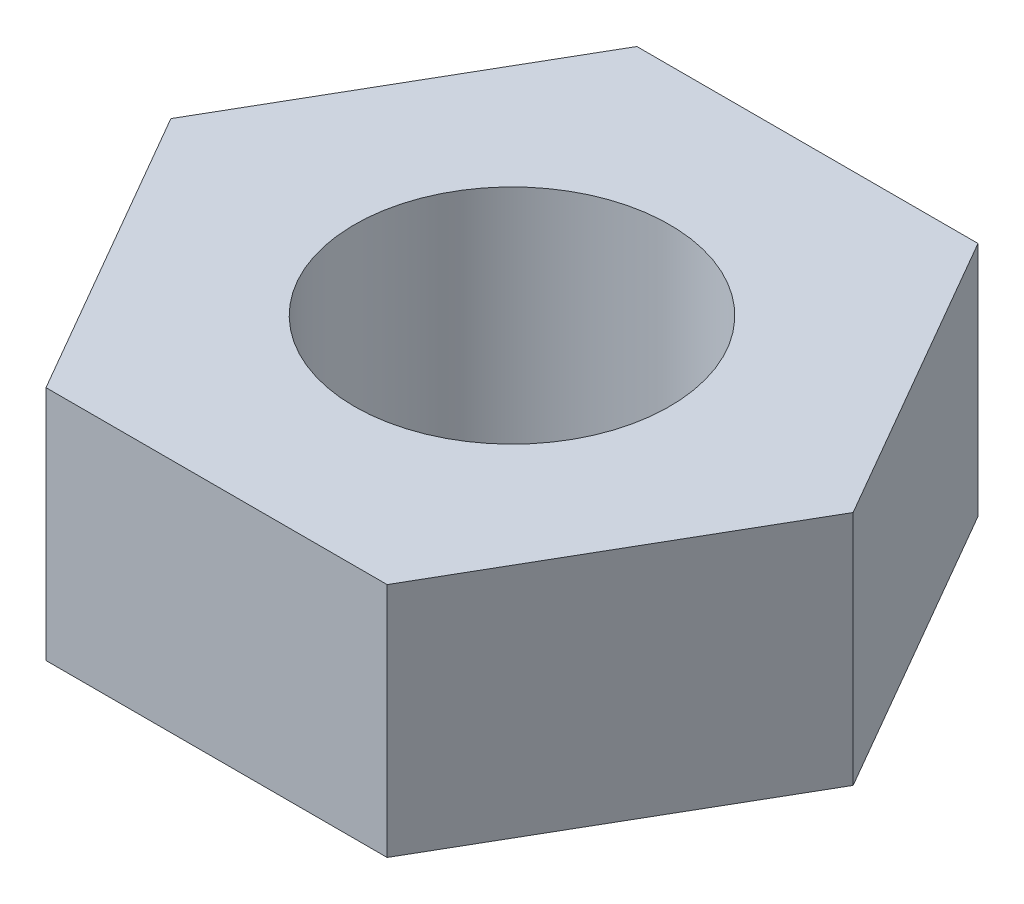
ISO-10303-21;
HEADER;
FILE_DESCRIPTION(('STEP AP214'),'2;1');
FILE_NAME('part.step','',(''),(''),'','','');
FILE_SCHEMA(('AUTOMOTIVE_DESIGN { 1 0 10303 214 1 1 1 1 }'));
ENDSEC;
DATA;
#1=APPLICATION_CONTEXT('core data for automotive mechanical design processes');
#2=APPLICATION_PROTOCOL_DEFINITION('international standard','automotive_design',2000,#1);
#3=PRODUCT_CONTEXT('',#1,'mechanical');
#4=PRODUCT('Part','Part','',(#3));
#5=PRODUCT_RELATED_PRODUCT_CATEGORY('part','',(#4));
#6=PRODUCT_DEFINITION_FORMATION('','',#4);
#7=PRODUCT_DEFINITION_CONTEXT('part definition',#1,'design');
#8=PRODUCT_DEFINITION('design','',#6,#7);
#9=PRODUCT_DEFINITION_SHAPE('','',#8);
#10=(LENGTH_UNIT() NAMED_UNIT(*) SI_UNIT(.MILLI.,.METRE.));
#11=(NAMED_UNIT(*) PLANE_ANGLE_UNIT() SI_UNIT($,.RADIAN.));
#12=(NAMED_UNIT(*) SI_UNIT($,.STERADIAN.) SOLID_ANGLE_UNIT());
#13=UNCERTAINTY_MEASURE_WITH_UNIT(LENGTH_MEASURE(1.E-05),#10,'distance_accuracy_value','');
#14=(GEOMETRIC_REPRESENTATION_CONTEXT(3) GLOBAL_UNCERTAINTY_ASSIGNED_CONTEXT((#13)) GLOBAL_UNIT_ASSIGNED_CONTEXT((#10,
#11,#12)) REPRESENTATION_CONTEXT('',''));
#15=CARTESIAN_POINT('',(0.,0.,0.));
#16=DIRECTION('',(0.,0.,1.));
#17=DIRECTION('',(1.,0.,0.));
#18=AXIS2_PLACEMENT_3D('',#15,#16,#17);
#19=CARTESIAN_POINT('',(0.,3.,0.));
#20=DIRECTION('',(0.,1.,0.));
#21=DIRECTION('',(0.,0.,1.));
#22=AXIS2_PLACEMENT_3D('',#19,#20,#21);
#23=PLANE('',#22);
#24=DIRECTION('',(0.499999999999995,0.,-0.866025403784441));
#25=VECTOR('',#24,1.);
#26=CARTESIAN_POINT('',(2.16506350946113,3.,3.74999999999996));
#27=LINE('',#26,#25);
#28=CARTESIAN_POINT('',(2.16506350946113,3.,3.74999999999996));
#29=VERTEX_POINT('',#28);
#30=CARTESIAN_POINT('',(4.33012701892218,3.,0.));
#31=VERTEX_POINT('',#30);
#32=EDGE_CURVE('E131',#29,#31,#27,.T.);
#33=ORIENTED_EDGE('',*,*,#32,.T.);
#34=DIRECTION('',(-0.500000000000001,0.,-0.866025403784438));
#35=VECTOR('',#34,1.);
#36=CARTESIAN_POINT('',(4.33012701892218,3.,0.));
#37=LINE('',#36,#35);
#38=CARTESIAN_POINT('',(2.16506350946108,3.,-3.74999999999999));
#39=VERTEX_POINT('',#38);
#40=EDGE_CURVE('E89',#31,#39,#37,.T.);
#41=ORIENTED_EDGE('',*,*,#40,.T.);
#42=DIRECTION('',(-1.,0.,0.));
#43=VECTOR('',#42,1.);
#44=CARTESIAN_POINT('',(2.16506350946108,3.,-3.74999999999999));
#45=LINE('',#44,#43);
#46=CARTESIAN_POINT('',(-2.16506350946111,3.,-3.74999999999998));
#47=VERTEX_POINT('',#46);
#48=EDGE_CURVE('E102',#39,#47,#45,.T.);
#49=ORIENTED_EDGE('',*,*,#48,.T.);
#50=DIRECTION('',(-0.499999999999995,0.,0.866025403784442));
#51=VECTOR('',#50,1.);
#52=CARTESIAN_POINT('',(-2.16506350946111,3.,-3.74999999999998));
#53=LINE('',#52,#51);
#54=CARTESIAN_POINT('',(-4.33012701892218,3.,0.));
#55=VERTEX_POINT('',#54);
#56=EDGE_CURVE('E96',#47,#55,#53,.T.);
#57=ORIENTED_EDGE('',*,*,#56,.T.);
#58=DIRECTION('',(0.500000000000007,0.,0.866025403784435));
#59=VECTOR('',#58,1.);
#60=CARTESIAN_POINT('',(-4.33012701892218,3.,0.));
#61=LINE('',#60,#59);
#62=CARTESIAN_POINT('',(-2.16506350946105,3.,3.75000000000001));
#63=VERTEX_POINT('',#62);
#64=EDGE_CURVE('E100',#55,#63,#61,.T.);
#65=ORIENTED_EDGE('',*,*,#64,.T.);
#66=DIRECTION('',(1.,0.,0.));
#67=VECTOR('',#66,1.);
#68=CARTESIAN_POINT('',(-2.16506350946105,3.,3.75000000000001));
#69=LINE('',#68,#67);
#70=EDGE_CURVE('E52',#63,#29,#69,.T.);
#71=ORIENTED_EDGE('',*,*,#70,.T.);
#72=EDGE_LOOP('',(#33,#41,#49,#57,#65,#71));
#73=FACE_BOUND('',#72,.T.);
#74=CARTESIAN_POINT('',(0.,3.,0.));
#75=DIRECTION('',(0.,1.,0.));
#76=DIRECTION('',(0.,0.,1.));
#77=AXIS2_PLACEMENT_3D('',#74,#75,#76);
#78=CIRCLE('',#77,2.);
#79=CARTESIAN_POINT('',(0.,3.,2.));
#80=VERTEX_POINT('',#79);
#81=EDGE_CURVE('E124',#80,#80,#78,.T.);
#82=ORIENTED_EDGE('',*,*,#81,.F.);
#83=EDGE_LOOP('',(#82));
#84=FACE_BOUND('',#83,.T.);
#85=ADVANCED_FACE('F35',(#73,#84),#23,.T.);
#86=CARTESIAN_POINT('',(0.,0.,0.));
#87=DIRECTION('',(0.,1.,0.));
#88=DIRECTION('',(0.,0.,1.));
#89=AXIS2_PLACEMENT_3D('',#86,#87,#88);
#90=PLANE('',#89);
#91=DIRECTION('',(0.499999999999995,0.,-0.866025403784441));
#92=VECTOR('',#91,1.);
#93=CARTESIAN_POINT('',(2.16506350946113,0.,3.74999999999996));
#94=LINE('',#93,#92);
#95=CARTESIAN_POINT('',(2.16506350946113,0.,3.74999999999996));
#96=VERTEX_POINT('',#95);
#97=CARTESIAN_POINT('',(4.33012701892218,0.,0.));
#98=VERTEX_POINT('',#97);
#99=EDGE_CURVE('E120',#96,#98,#94,.T.);
#100=ORIENTED_EDGE('',*,*,#99,.F.);
#101=DIRECTION('',(1.,0.,0.));
#102=VECTOR('',#101,1.);
#103=CARTESIAN_POINT('',(-2.16506350946105,0.,3.75000000000001));
#104=LINE('',#103,#102);
#105=CARTESIAN_POINT('',(-2.16506350946105,0.,3.75000000000001));
#106=VERTEX_POINT('',#105);
#107=EDGE_CURVE('E81',#106,#96,#104,.T.);
#108=ORIENTED_EDGE('',*,*,#107,.F.);
#109=DIRECTION('',(0.500000000000007,0.,0.866025403784435));
#110=VECTOR('',#109,1.);
#111=CARTESIAN_POINT('',(-4.33012701892218,0.,0.));
#112=LINE('',#111,#110);
#113=CARTESIAN_POINT('',(-4.33012701892218,0.,0.));
#114=VERTEX_POINT('',#113);
#115=EDGE_CURVE('E75',#114,#106,#112,.T.);
#116=ORIENTED_EDGE('',*,*,#115,.F.);
#117=DIRECTION('',(-0.499999999999995,0.,0.866025403784442));
#118=VECTOR('',#117,1.);
#119=CARTESIAN_POINT('',(-2.16506350946111,0.,-3.74999999999998));
#120=LINE('',#119,#118);
#121=CARTESIAN_POINT('',(-2.16506350946111,0.,-3.74999999999998));
#122=VERTEX_POINT('',#121);
#123=EDGE_CURVE('E110',#122,#114,#120,.T.);
#124=ORIENTED_EDGE('',*,*,#123,.F.);
#125=DIRECTION('',(-1.,0.,0.));
#126=VECTOR('',#125,1.);
#127=CARTESIAN_POINT('',(2.16506350946108,0.,-3.74999999999999));
#128=LINE('',#127,#126);
#129=CARTESIAN_POINT('',(2.16506350946108,0.,-3.74999999999999));
#130=VERTEX_POINT('',#129);
#131=EDGE_CURVE('E126',#130,#122,#128,.T.);
#132=ORIENTED_EDGE('',*,*,#131,.F.);
#133=DIRECTION('',(-0.500000000000001,0.,-0.866025403784438));
#134=VECTOR('',#133,1.);
#135=CARTESIAN_POINT('',(4.33012701892218,0.,0.));
#136=LINE('',#135,#134);
#137=EDGE_CURVE('E123',#98,#130,#136,.T.);
#138=ORIENTED_EDGE('',*,*,#137,.F.);
#139=EDGE_LOOP('',(#100,#108,#116,#124,#132,#138));
#140=FACE_BOUND('',#139,.T.);
#141=CARTESIAN_POINT('',(0.,0.,0.));
#142=DIRECTION('',(0.,1.,0.));
#143=DIRECTION('',(0.,0.,1.));
#144=AXIS2_PLACEMENT_3D('',#141,#142,#143);
#145=CIRCLE('',#144,2.);
#146=CARTESIAN_POINT('',(0.,0.,2.));
#147=VERTEX_POINT('',#146);
#148=EDGE_CURVE('E224',#147,#147,#145,.T.);
#149=ORIENTED_EDGE('',*,*,#148,.T.);
#150=EDGE_LOOP('',(#149));
#151=FACE_BOUND('',#150,.T.);
#152=ADVANCED_FACE('F140',(#140,#151),#90,.F.);
#153=CARTESIAN_POINT('',(2.16506350946113,3.,3.74999999999996));
#154=DIRECTION('',(-0.866025403784442,0.,-0.499999999999995));
#155=DIRECTION('',(-0.499999999999995,0.,0.866025403784442));
#156=AXIS2_PLACEMENT_3D('',#153,#154,#155);
#157=PLANE('',#156);
#158=ORIENTED_EDGE('',*,*,#99,.T.);
#159=DIRECTION('',(0.,-1.,0.));
#160=VECTOR('',#159,1.);
#161=CARTESIAN_POINT('',(4.33012701892218,3.,0.));
#162=LINE('',#161,#160);
#163=EDGE_CURVE('E11',#31,#98,#162,.T.);
#164=ORIENTED_EDGE('',*,*,#163,.F.);
#165=ORIENTED_EDGE('',*,*,#32,.F.);
#166=DIRECTION('',(0.,-1.,0.));
#167=VECTOR('',#166,1.);
#168=CARTESIAN_POINT('',(2.16506350946113,3.,3.74999999999996));
#169=LINE('',#168,#167);
#170=EDGE_CURVE('E116',#29,#96,#169,.T.);
#171=ORIENTED_EDGE('',*,*,#170,.T.);
#172=EDGE_LOOP('',(#158,#164,#165,#171));
#173=FACE_BOUND('',#172,.T.);
#174=ADVANCED_FACE('F37',(#173),#157,.F.);
#175=CARTESIAN_POINT('',(4.33012701892218,3.,0.));
#176=DIRECTION('',(-0.866025403784438,0.,0.500000000000001));
#177=DIRECTION('',(0.500000000000001,0.,0.866025403784438));
#178=AXIS2_PLACEMENT_3D('',#175,#176,#177);
#179=PLANE('',#178);
#180=ORIENTED_EDGE('',*,*,#137,.T.);
#181=DIRECTION('',(0.,-1.,0.));
#182=VECTOR('',#181,1.);
#183=CARTESIAN_POINT('',(2.16506350946108,3.,-3.74999999999999));
#184=LINE('',#183,#182);
#185=EDGE_CURVE('E44',#39,#130,#184,.T.);
#186=ORIENTED_EDGE('',*,*,#185,.F.);
#187=ORIENTED_EDGE('',*,*,#40,.F.);
#188=ORIENTED_EDGE('',*,*,#163,.T.);
#189=EDGE_LOOP('',(#180,#186,#187,#188));
#190=FACE_BOUND('',#189,.T.);
#191=ADVANCED_FACE('F165',(#190),#179,.F.);
#192=CARTESIAN_POINT('',(2.16506350946108,3.,-3.74999999999999));
#193=DIRECTION('',(0.,0.,1.));
#194=DIRECTION('',(1.,0.,0.));
#195=AXIS2_PLACEMENT_3D('',#192,#193,#194);
#196=PLANE('',#195);
#197=ORIENTED_EDGE('',*,*,#131,.T.);
#198=DIRECTION('',(0.,-1.,0.));
#199=VECTOR('',#198,1.);
#200=CARTESIAN_POINT('',(-2.16506350946111,3.,-3.74999999999998));
#201=LINE('',#200,#199);
#202=EDGE_CURVE('E111',#47,#122,#201,.T.);
#203=ORIENTED_EDGE('',*,*,#202,.F.);
#204=ORIENTED_EDGE('',*,*,#48,.F.);
#205=ORIENTED_EDGE('',*,*,#185,.T.);
#206=EDGE_LOOP('',(#197,#203,#204,#205));
#207=FACE_BOUND('',#206,.T.);
#208=ADVANCED_FACE('F137',(#207),#196,.F.);
#209=CARTESIAN_POINT('',(-2.16506350946111,3.,-3.74999999999998));
#210=DIRECTION('',(0.866025403784441,0.,0.499999999999995));
#211=DIRECTION('',(0.499999999999995,0.,-0.866025403784442));
#212=AXIS2_PLACEMENT_3D('',#209,#210,#211);
#213=PLANE('',#212);
#214=ORIENTED_EDGE('',*,*,#123,.T.);
#215=DIRECTION('',(0.,-1.,0.));
#216=VECTOR('',#215,1.);
#217=CARTESIAN_POINT('',(-4.33012701892218,3.,0.));
#218=LINE('',#217,#216);
#219=EDGE_CURVE('E107',#55,#114,#218,.T.);
#220=ORIENTED_EDGE('',*,*,#219,.F.);
#221=ORIENTED_EDGE('',*,*,#56,.F.);
#222=ORIENTED_EDGE('',*,*,#202,.T.);
#223=EDGE_LOOP('',(#214,#220,#221,#222));
#224=FACE_BOUND('',#223,.T.);
#225=ADVANCED_FACE('F108',(#224),#213,.F.);
#226=CARTESIAN_POINT('',(-4.33012701892218,3.,0.));
#227=DIRECTION('',(0.866025403784435,0.,-0.500000000000007));
#228=DIRECTION('',(-0.500000000000007,0.,-0.866025403784435));
#229=AXIS2_PLACEMENT_3D('',#226,#227,#228);
#230=PLANE('',#229);
#231=ORIENTED_EDGE('',*,*,#115,.T.);
#232=DIRECTION('',(0.,-1.,0.));
#233=VECTOR('',#232,1.);
#234=CARTESIAN_POINT('',(-2.16506350946105,3.,3.75000000000001));
#235=LINE('',#234,#233);
#236=EDGE_CURVE('E112',#63,#106,#235,.T.);
#237=ORIENTED_EDGE('',*,*,#236,.F.);
#238=ORIENTED_EDGE('',*,*,#64,.F.);
#239=ORIENTED_EDGE('',*,*,#219,.T.);
#240=EDGE_LOOP('',(#231,#237,#238,#239));
#241=FACE_BOUND('',#240,.T.);
#242=ADVANCED_FACE('F114',(#241),#230,.F.);
#243=CARTESIAN_POINT('',(-2.16506350946105,3.,3.75000000000001));
#244=DIRECTION('',(0.,0.,-1.));
#245=DIRECTION('',(-1.,0.,0.));
#246=AXIS2_PLACEMENT_3D('',#243,#244,#245);
#247=PLANE('',#246);
#248=ORIENTED_EDGE('',*,*,#107,.T.);
#249=ORIENTED_EDGE('',*,*,#170,.F.);
#250=ORIENTED_EDGE('',*,*,#70,.F.);
#251=ORIENTED_EDGE('',*,*,#236,.T.);
#252=EDGE_LOOP('',(#248,#249,#250,#251));
#253=FACE_BOUND('',#252,.T.);
#254=ADVANCED_FACE('F145',(#253),#247,.F.);
#255=CARTESIAN_POINT('',(0.,3.,0.));
#256=DIRECTION('',(0.,-1.,0.));
#257=DIRECTION('',(0.,0.,-1.));
#258=AXIS2_PLACEMENT_3D('',#255,#256,#257);
#259=CYLINDRICAL_SURFACE('',#258,2.);
#260=ORIENTED_EDGE('',*,*,#81,.T.);
#261=EDGE_LOOP('',(#260));
#262=FACE_BOUND('',#261,.T.);
#263=ORIENTED_EDGE('',*,*,#148,.F.);
#264=EDGE_LOOP('',(#263));
#265=FACE_BOUND('',#264,.T.);
#266=ADVANCED_FACE('F147',(#262,#265),#259,.F.);
#267=CLOSED_SHELL('',(#85,#152,#174,#191,#208,#225,#242,#254,#266));
#268=MANIFOLD_SOLID_BREP('B2',#267);
#269=ADVANCED_BREP_SHAPE_REPRESENTATION('',(#18,#268),#14);
#270=SHAPE_DEFINITION_REPRESENTATION(#9,#269);
ENDSEC;
END-ISO-10303-21;
